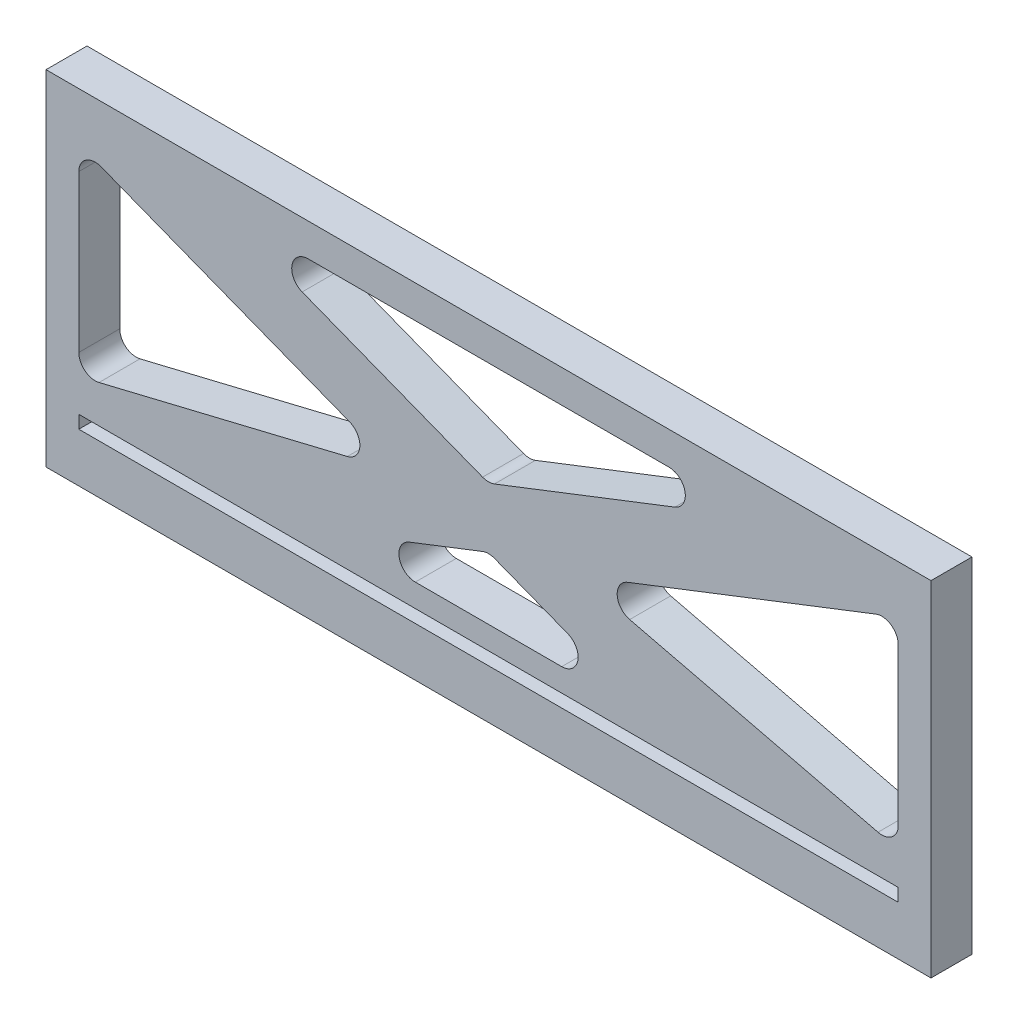
ISO-10303-21;
HEADER;
FILE_DESCRIPTION(('STEP AP214'),'2;1');
FILE_NAME('part.step','',(''),(''),'','','');
FILE_SCHEMA(('AUTOMOTIVE_DESIGN { 1 0 10303 214 1 1 1 1 }'));
ENDSEC;
DATA;
#1=APPLICATION_CONTEXT('core data for automotive mechanical design processes');
#2=APPLICATION_PROTOCOL_DEFINITION('international standard','automotive_design',2000,#1);
#3=PRODUCT_CONTEXT('',#1,'mechanical');
#4=PRODUCT('Part','Part','',(#3));
#5=PRODUCT_RELATED_PRODUCT_CATEGORY('part','',(#4));
#6=PRODUCT_DEFINITION_FORMATION('','',#4);
#7=PRODUCT_DEFINITION_CONTEXT('part definition',#1,'design');
#8=PRODUCT_DEFINITION('design','',#6,#7);
#9=PRODUCT_DEFINITION_SHAPE('','',#8);
#10=(LENGTH_UNIT() NAMED_UNIT(*) SI_UNIT(.MILLI.,.METRE.));
#11=(NAMED_UNIT(*) PLANE_ANGLE_UNIT() SI_UNIT($,.RADIAN.));
#12=(NAMED_UNIT(*) SI_UNIT($,.STERADIAN.) SOLID_ANGLE_UNIT());
#13=UNCERTAINTY_MEASURE_WITH_UNIT(LENGTH_MEASURE(1.E-05),#10,'distance_accuracy_value','');
#14=(GEOMETRIC_REPRESENTATION_CONTEXT(3) GLOBAL_UNCERTAINTY_ASSIGNED_CONTEXT((#13)) GLOBAL_UNIT_ASSIGNED_CONTEXT((#10,
#11,#12)) REPRESENTATION_CONTEXT('',''));
#15=CARTESIAN_POINT('',(0.,0.,0.));
#16=DIRECTION('',(0.,0.,1.));
#17=DIRECTION('',(1.,0.,0.));
#18=AXIS2_PLACEMENT_3D('',#15,#16,#17);
#19=CARTESIAN_POINT('',(0.,0.,3.175));
#20=DIRECTION('',(0.,0.,-1.));
#21=DIRECTION('',(-1.,0.,0.));
#22=AXIS2_PLACEMENT_3D('',#19,#20,#21);
#23=PLANE('',#22);
#24=DIRECTION('',(0.971967602609404,-0.235114821901402,0.));
#25=VECTOR('',#24,1.);
#26=CARTESIAN_POINT('',(31.75,-5.985,3.175));
#27=LINE('',#26,#25);
#28=CARTESIAN_POINT('',(10.941024900875,-0.951397582340412,3.175));
#29=VERTEX_POINT('',#28);
#30=CARTESIAN_POINT('',(30.1814041761852,-5.60556335338607,3.175));
#31=VERTEX_POINT('',#30);
#32=EDGE_CURVE('E532',#29,#31,#27,.T.);
#33=ORIENTED_EDGE('',*,*,#32,.F.);
#34=CARTESIAN_POINT('',(11.2396207246898,0.283001272973529,3.175));
#35=DIRECTION('',(0.,0.,-1.));
#36=DIRECTION('',(-1.,0.,0.));
#37=AXIS2_PLACEMENT_3D('',#34,#35,#36);
#38=CIRCLE('',#37,1.27);
#39=CARTESIAN_POINT('',(10.779313973023,1.46664720583098,3.175));
#40=VERTEX_POINT('',#39);
#41=EDGE_CURVE('E445',#29,#40,#38,.T.);
#42=ORIENTED_EDGE('',*,*,#41,.T.);
#43=DIRECTION('',(-0.932004671541298,-0.362446261154944,0.));
#44=VECTOR('',#43,1.);
#45=CARTESIAN_POINT('',(7.00793544374329,0.,3.175));
#46=LINE('',#45,#44);
#47=CARTESIAN_POINT('',(30.0196932483333,8.94901692400708,3.175));
#48=VERTEX_POINT('',#47);
#49=EDGE_CURVE('E541',#48,#40,#46,.T.);
#50=ORIENTED_EDGE('',*,*,#49,.F.);
#51=CARTESIAN_POINT('',(30.48,7.76537099114963,3.175));
#52=DIRECTION('',(0.,0.,-1.));
#53=DIRECTION('',(-1.,0.,0.));
#54=AXIS2_PLACEMENT_3D('',#51,#52,#53);
#55=CIRCLE('',#54,1.27);
#56=CARTESIAN_POINT('',(31.75,7.76537099114963,3.175));
#57=VERTEX_POINT('',#56);
#58=EDGE_CURVE('E433',#48,#57,#55,.T.);
#59=ORIENTED_EDGE('',*,*,#58,.T.);
#60=DIRECTION('',(0.,1.,0.));
#61=VECTOR('',#60,1.);
#62=CARTESIAN_POINT('',(31.75,9.62191399409971,3.175));
#63=LINE('',#62,#61);
#64=CARTESIAN_POINT('',(31.75,-4.37116449807213,3.175));
#65=VERTEX_POINT('',#64);
#66=EDGE_CURVE('E536',#65,#57,#63,.T.);
#67=ORIENTED_EDGE('',*,*,#66,.F.);
#68=CARTESIAN_POINT('',(30.48,-4.37116449807213,3.175));
#69=DIRECTION('',(0.,0.,-1.));
#70=DIRECTION('',(-1.,0.,0.));
#71=AXIS2_PLACEMENT_3D('',#68,#69,#70);
#72=CIRCLE('',#71,1.27);
#73=EDGE_CURVE('E439',#65,#31,#72,.T.);
#74=ORIENTED_EDGE('',*,*,#73,.T.);
#75=EDGE_LOOP('',(#33,#42,#50,#59,#67,#74));
#76=FACE_BOUND('',#75,.T.);
#77=DIRECTION('',(-1.,0.,0.));
#78=VECTOR('',#77,1.);
#79=CARTESIAN_POINT('',(20.7506359848282,10.795,3.175));
#80=LINE('',#79,#78);
#81=CARTESIAN_POINT('',(13.9809539772422,10.795,3.175));
#82=VERTEX_POINT('',#81);
#83=CARTESIAN_POINT('',(-13.9809539772422,10.795,3.175));
#84=VERTEX_POINT('',#83);
#85=EDGE_CURVE('E580',#82,#84,#80,.T.);
#86=ORIENTED_EDGE('',*,*,#85,.F.);
#87=CARTESIAN_POINT('',(13.9809539772422,9.52500000000001,3.175));
#88=DIRECTION('',(0.,0.,-1.));
#89=DIRECTION('',(-1.,0.,0.));
#90=AXIS2_PLACEMENT_3D('',#87,#88,#89);
#91=CIRCLE('',#90,1.27);
#92=CARTESIAN_POINT('',(14.441260728909,8.34135406714256,3.175));
#93=VERTEX_POINT('',#92);
#94=EDGE_CURVE('E451',#82,#93,#91,.T.);
#95=ORIENTED_EDGE('',*,*,#94,.T.);
#96=DIRECTION('',(0.932004671541296,0.362446261154949,0.));
#97=VECTOR('',#96,1.);
#98=CARTESIAN_POINT('',(0.,2.72530822812238,3.175));
#99=LINE('',#98,#97);
#100=CARTESIAN_POINT('',(0.460306751666785,2.90431640932613,3.175));
#101=VERTEX_POINT('',#100);
#102=EDGE_CURVE('E289',#101,#93,#99,.T.);
#103=ORIENTED_EDGE('',*,*,#102,.F.);
#104=CARTESIAN_POINT('',(0.,4.08796234218358,3.175));
#105=DIRECTION('',(0.,0.,-1.));
#106=DIRECTION('',(-1.,0.,0.));
#107=AXIS2_PLACEMENT_3D('',#104,#105,#106);
#108=CIRCLE('',#107,1.27);
#109=CARTESIAN_POINT('',(-0.460306751666785,2.90431640932613,3.175));
#110=VERTEX_POINT('',#109);
#111=EDGE_CURVE('E463',#101,#110,#108,.T.);
#112=ORIENTED_EDGE('',*,*,#111,.T.);
#113=DIRECTION('',(0.932004671541296,-0.362446261154949,0.));
#114=VECTOR('',#113,1.);
#115=CARTESIAN_POINT('',(-20.7506359848282,10.795,3.175));
#116=LINE('',#115,#114);
#117=CARTESIAN_POINT('',(-14.441260728909,8.34135406714256,3.175));
#118=VERTEX_POINT('',#117);
#119=EDGE_CURVE('E584',#118,#110,#116,.T.);
#120=ORIENTED_EDGE('',*,*,#119,.F.);
#121=CARTESIAN_POINT('',(-13.9809539772422,9.52500000000001,3.175));
#122=DIRECTION('',(0.,0.,-1.));
#123=DIRECTION('',(-1.,0.,0.));
#124=AXIS2_PLACEMENT_3D('',#121,#122,#123);
#125=CIRCLE('',#124,1.27);
#126=EDGE_CURVE('E457',#118,#84,#125,.T.);
#127=ORIENTED_EDGE('',*,*,#126,.T.);
#128=EDGE_LOOP('',(#86,#95,#103,#112,#120,#127));
#129=FACE_BOUND('',#128,.T.);
#130=DIRECTION('',(0.,1.,0.));
#131=VECTOR('',#130,1.);
#132=CARTESIAN_POINT('',(34.29,-13.335,3.175));
#133=LINE('',#132,#131);
#134=CARTESIAN_POINT('',(34.29,-13.335,3.175));
#135=VERTEX_POINT('',#134);
#136=CARTESIAN_POINT('',(34.29,13.335,3.175));
#137=VERTEX_POINT('',#136);
#138=EDGE_CURVE('E306',#135,#137,#133,.T.);
#139=ORIENTED_EDGE('',*,*,#138,.T.);
#140=DIRECTION('',(-1.,0.,0.));
#141=VECTOR('',#140,1.);
#142=CARTESIAN_POINT('',(-34.29,13.335,3.175));
#143=LINE('',#142,#141);
#144=CARTESIAN_POINT('',(-34.29,13.335,3.175));
#145=VERTEX_POINT('',#144);
#146=EDGE_CURVE('E310',#137,#145,#143,.T.);
#147=ORIENTED_EDGE('',*,*,#146,.T.);
#148=DIRECTION('',(0.,-1.,0.));
#149=VECTOR('',#148,1.);
#150=CARTESIAN_POINT('',(-34.29,-13.335,3.175));
#151=LINE('',#150,#149);
#152=CARTESIAN_POINT('',(-34.29,-13.335,3.175));
#153=VERTEX_POINT('',#152);
#154=EDGE_CURVE('E314',#145,#153,#151,.T.);
#155=ORIENTED_EDGE('',*,*,#154,.T.);
#156=DIRECTION('',(1.,0.,0.));
#157=VECTOR('',#156,1.);
#158=CARTESIAN_POINT('',(-34.29,-13.335,3.175));
#159=LINE('',#158,#157);
#160=EDGE_CURVE('E317',#153,#135,#159,.T.);
#161=ORIENTED_EDGE('',*,*,#160,.T.);
#162=EDGE_LOOP('',(#139,#147,#155,#161));
#163=FACE_BOUND('',#162,.T.);
#164=DIRECTION('',(0.,1.,0.));
#165=VECTOR('',#164,1.);
#166=CARTESIAN_POINT('',(31.75,-9.525,3.175));
#167=LINE('',#166,#165);
#168=CARTESIAN_POINT('',(31.75,-9.525,3.175));
#169=VERTEX_POINT('',#168);
#170=CARTESIAN_POINT('',(31.75,-8.525,3.175));
#171=VERTEX_POINT('',#170);
#172=EDGE_CURVE('E250',#169,#171,#167,.T.);
#173=ORIENTED_EDGE('',*,*,#172,.F.);
#174=DIRECTION('',(1.,0.,0.));
#175=VECTOR('',#174,1.);
#176=CARTESIAN_POINT('',(-31.75,-9.525,3.175));
#177=LINE('',#176,#175);
#178=CARTESIAN_POINT('',(-31.75,-9.525,3.175));
#179=VERTEX_POINT('',#178);
#180=EDGE_CURVE('E280',#179,#169,#177,.T.);
#181=ORIENTED_EDGE('',*,*,#180,.F.);
#182=DIRECTION('',(0.,-1.,0.));
#183=VECTOR('',#182,1.);
#184=CARTESIAN_POINT('',(-31.75,-9.525,3.175));
#185=LINE('',#184,#183);
#186=CARTESIAN_POINT('',(-31.75,-8.525,3.175));
#187=VERTEX_POINT('',#186);
#188=EDGE_CURVE('E276',#187,#179,#185,.T.);
#189=ORIENTED_EDGE('',*,*,#188,.F.);
#190=DIRECTION('',(-1.,0.,0.));
#191=VECTOR('',#190,1.);
#192=CARTESIAN_POINT('',(-31.75,-8.525,3.175));
#193=LINE('',#192,#191);
#194=EDGE_CURVE('E261',#171,#187,#193,.T.);
#195=ORIENTED_EDGE('',*,*,#194,.F.);
#196=EDGE_LOOP('',(#173,#181,#189,#195));
#197=FACE_BOUND('',#196,.T.);
#198=DIRECTION('',(-0.932004671541296,0.362446261154948,0.));
#199=VECTOR('',#198,1.);
#200=CARTESIAN_POINT('',(-7.0079354437433,0.,3.175));
#201=LINE('',#200,#199);
#202=CARTESIAN_POINT('',(-10.779313973023,1.46664720583098,3.175));
#203=VERTEX_POINT('',#202);
#204=CARTESIAN_POINT('',(-30.0196932483332,8.94901692400719,3.175));
#205=VERTEX_POINT('',#204);
#206=EDGE_CURVE('E556',#203,#205,#201,.T.);
#207=ORIENTED_EDGE('',*,*,#206,.F.);
#208=CARTESIAN_POINT('',(-11.2396207246897,0.283001272973534,3.175));
#209=DIRECTION('',(0.,0.,-1.));
#210=DIRECTION('',(-1.,0.,0.));
#211=AXIS2_PLACEMENT_3D('',#208,#209,#210);
#212=CIRCLE('',#211,1.27);
#213=CARTESIAN_POINT('',(-10.941024900875,-0.951397582340408,3.175));
#214=VERTEX_POINT('',#213);
#215=EDGE_CURVE('E469',#203,#214,#212,.T.);
#216=ORIENTED_EDGE('',*,*,#215,.T.);
#217=DIRECTION('',(0.971967602609404,0.235114821901402,0.));
#218=VECTOR('',#217,1.);
#219=CARTESIAN_POINT('',(-31.75,-5.985,3.175));
#220=LINE('',#219,#218);
#221=CARTESIAN_POINT('',(-30.1814041761852,-5.60556335338607,3.175));
#222=VERTEX_POINT('',#221);
#223=EDGE_CURVE('E565',#222,#214,#220,.T.);
#224=ORIENTED_EDGE('',*,*,#223,.F.);
#225=CARTESIAN_POINT('',(-30.48,-4.37116449807213,3.175));
#226=DIRECTION('',(0.,0.,-1.));
#227=DIRECTION('',(-1.,0.,0.));
#228=AXIS2_PLACEMENT_3D('',#225,#226,#227);
#229=CIRCLE('',#228,1.27);
#230=CARTESIAN_POINT('',(-31.75,-4.37116449807213,3.175));
#231=VERTEX_POINT('',#230);
#232=EDGE_CURVE('E481',#222,#231,#229,.T.);
#233=ORIENTED_EDGE('',*,*,#232,.T.);
#234=DIRECTION('',(0.,-1.,0.));
#235=VECTOR('',#234,1.);
#236=CARTESIAN_POINT('',(-31.75,9.62191399409983,3.175));
#237=LINE('',#236,#235);
#238=CARTESIAN_POINT('',(-31.75,7.76537099114975,3.175));
#239=VERTEX_POINT('',#238);
#240=EDGE_CURVE('E560',#239,#231,#237,.T.);
#241=ORIENTED_EDGE('',*,*,#240,.F.);
#242=CARTESIAN_POINT('',(-30.48,7.76537099114975,3.175));
#243=DIRECTION('',(0.,0.,-1.));
#244=DIRECTION('',(-1.,0.,0.));
#245=AXIS2_PLACEMENT_3D('',#242,#243,#244);
#246=CIRCLE('',#245,1.27);
#247=EDGE_CURVE('E475',#239,#205,#246,.T.);
#248=ORIENTED_EDGE('',*,*,#247,.T.);
#249=EDGE_LOOP('',(#207,#216,#224,#233,#241,#248));
#250=FACE_BOUND('',#249,.T.);
#251=DIRECTION('',(-0.932004671541296,0.362446261154949,0.));
#252=VECTOR('',#251,1.);
#253=CARTESIAN_POINT('',(12.4438737608083,-6.747,3.175));
#254=LINE('',#253,#252);
#255=CARTESIAN_POINT('',(6.13449850488913,-4.29335406714256,3.175));
#256=VERTEX_POINT('',#255);
#257=CARTESIAN_POINT('',(0.46030675166678,-2.08672394088942,3.175));
#258=VERTEX_POINT('',#257);
#259=EDGE_CURVE('E511',#256,#258,#254,.T.);
#260=ORIENTED_EDGE('',*,*,#259,.F.);
#261=CARTESIAN_POINT('',(5.67419175322234,-5.477,3.175));
#262=DIRECTION('',(0.,0.,-1.));
#263=DIRECTION('',(-1.,0.,0.));
#264=AXIS2_PLACEMENT_3D('',#261,#262,#263);
#265=CIRCLE('',#264,1.27);
#266=CARTESIAN_POINT('',(5.67419175322234,-6.747,3.175));
#267=VERTEX_POINT('',#266);
#268=EDGE_CURVE('E487',#256,#267,#265,.T.);
#269=ORIENTED_EDGE('',*,*,#268,.T.);
#270=DIRECTION('',(1.,0.,0.));
#271=VECTOR('',#270,1.);
#272=CARTESIAN_POINT('',(-12.4438737608083,-6.747,3.175));
#273=LINE('',#272,#271);
#274=CARTESIAN_POINT('',(-5.67419175322235,-6.747,3.175));
#275=VERTEX_POINT('',#274);
#276=EDGE_CURVE('E517',#275,#267,#273,.T.);
#277=ORIENTED_EDGE('',*,*,#276,.F.);
#278=CARTESIAN_POINT('',(-5.67419175322235,-5.477,3.175));
#279=DIRECTION('',(0.,0.,-1.));
#280=DIRECTION('',(-1.,0.,0.));
#281=AXIS2_PLACEMENT_3D('',#278,#279,#280);
#282=CIRCLE('',#281,1.27);
#283=CARTESIAN_POINT('',(-6.13449850488913,-4.29335406714256,3.175));
#284=VERTEX_POINT('',#283);
#285=EDGE_CURVE('E11',#275,#284,#282,.T.);
#286=ORIENTED_EDGE('',*,*,#285,.T.);
#287=DIRECTION('',(-0.932004671541296,-0.362446261154949,0.));
#288=VECTOR('',#287,1.);
#289=CARTESIAN_POINT('',(0.,-1.90771575968567,3.175));
#290=LINE('',#289,#288);
#291=CARTESIAN_POINT('',(-0.460306751666788,-2.08672394088942,3.175));
#292=VERTEX_POINT('',#291);
#293=EDGE_CURVE('E514',#292,#284,#290,.T.);
#294=ORIENTED_EDGE('',*,*,#293,.F.);
#295=CARTESIAN_POINT('',(0.,-3.27036987374687,3.175));
#296=DIRECTION('',(0.,0.,-1.));
#297=DIRECTION('',(-1.,0.,0.));
#298=AXIS2_PLACEMENT_3D('',#295,#296,#297);
#299=CIRCLE('',#298,1.27);
#300=EDGE_CURVE('E493',#292,#258,#299,.T.);
#301=ORIENTED_EDGE('',*,*,#300,.T.);
#302=EDGE_LOOP('',(#260,#269,#277,#286,#294,#301));
#303=FACE_BOUND('',#302,.T.);
#304=ADVANCED_FACE('F39',(#76,#129,#163,#197,#250,#303),#23,.F.);
#305=CARTESIAN_POINT('',(0.,0.,0.));
#306=DIRECTION('',(0.,0.,-1.));
#307=DIRECTION('',(-1.,0.,0.));
#308=AXIS2_PLACEMENT_3D('',#305,#306,#307);
#309=PLANE('',#308);
#310=DIRECTION('',(0.,1.,0.));
#311=VECTOR('',#310,1.);
#312=CARTESIAN_POINT('',(34.29,-13.335,0.));
#313=LINE('',#312,#311);
#314=CARTESIAN_POINT('',(34.29,-13.335,0.));
#315=VERTEX_POINT('',#314);
#316=CARTESIAN_POINT('',(34.29,13.335,0.));
#317=VERTEX_POINT('',#316);
#318=EDGE_CURVE('E270',#315,#317,#313,.T.);
#319=ORIENTED_EDGE('',*,*,#318,.F.);
#320=DIRECTION('',(1.,0.,0.));
#321=VECTOR('',#320,1.);
#322=CARTESIAN_POINT('',(-34.29,-13.335,0.));
#323=LINE('',#322,#321);
#324=CARTESIAN_POINT('',(-34.29,-13.335,0.));
#325=VERTEX_POINT('',#324);
#326=EDGE_CURVE('E311',#325,#315,#323,.T.);
#327=ORIENTED_EDGE('',*,*,#326,.F.);
#328=DIRECTION('',(0.,-1.,0.));
#329=VECTOR('',#328,1.);
#330=CARTESIAN_POINT('',(-34.29,-13.335,0.));
#331=LINE('',#330,#329);
#332=CARTESIAN_POINT('',(-34.29,13.335,0.));
#333=VERTEX_POINT('',#332);
#334=EDGE_CURVE('E327',#333,#325,#331,.T.);
#335=ORIENTED_EDGE('',*,*,#334,.F.);
#336=DIRECTION('',(-1.,0.,0.));
#337=VECTOR('',#336,1.);
#338=CARTESIAN_POINT('',(-34.29,13.335,0.));
#339=LINE('',#338,#337);
#340=EDGE_CURVE('E324',#317,#333,#339,.T.);
#341=ORIENTED_EDGE('',*,*,#340,.F.);
#342=EDGE_LOOP('',(#319,#327,#335,#341));
#343=FACE_BOUND('',#342,.T.);
#344=DIRECTION('',(1.,0.,0.));
#345=VECTOR('',#344,1.);
#346=CARTESIAN_POINT('',(-31.75,-9.525,0.));
#347=LINE('',#346,#345);
#348=CARTESIAN_POINT('',(-31.75,-9.525,0.));
#349=VERTEX_POINT('',#348);
#350=CARTESIAN_POINT('',(31.75,-9.525,0.));
#351=VERTEX_POINT('',#350);
#352=EDGE_CURVE('E262',#349,#351,#347,.T.);
#353=ORIENTED_EDGE('',*,*,#352,.T.);
#354=DIRECTION('',(0.,1.,0.));
#355=VECTOR('',#354,1.);
#356=CARTESIAN_POINT('',(31.75,-9.525,0.));
#357=LINE('',#356,#355);
#358=CARTESIAN_POINT('',(31.75,-8.525,0.));
#359=VERTEX_POINT('',#358);
#360=EDGE_CURVE('E286',#351,#359,#357,.T.);
#361=ORIENTED_EDGE('',*,*,#360,.T.);
#362=DIRECTION('',(-1.,0.,0.));
#363=VECTOR('',#362,1.);
#364=CARTESIAN_POINT('',(-31.75,-8.525,0.));
#365=LINE('',#364,#363);
#366=CARTESIAN_POINT('',(-31.75,-8.525,0.));
#367=VERTEX_POINT('',#366);
#368=EDGE_CURVE('E268',#359,#367,#365,.T.);
#369=ORIENTED_EDGE('',*,*,#368,.T.);
#370=DIRECTION('',(0.,-1.,0.));
#371=VECTOR('',#370,1.);
#372=CARTESIAN_POINT('',(-31.75,-9.525,0.));
#373=LINE('',#372,#371);
#374=EDGE_CURVE('E292',#367,#349,#373,.T.);
#375=ORIENTED_EDGE('',*,*,#374,.T.);
#376=EDGE_LOOP('',(#353,#361,#369,#375));
#377=FACE_BOUND('',#376,.T.);
#378=DIRECTION('',(0.932004671541296,-0.362446261154949,0.));
#379=VECTOR('',#378,1.);
#380=CARTESIAN_POINT('',(-20.7506359848282,10.795,0.));
#381=LINE('',#380,#379);
#382=CARTESIAN_POINT('',(-14.441260728909,8.34135406714256,0.));
#383=VERTEX_POINT('',#382);
#384=CARTESIAN_POINT('',(-0.460306751666785,2.90431640932613,0.));
#385=VERTEX_POINT('',#384);
#386=EDGE_CURVE('E595',#383,#385,#381,.T.);
#387=ORIENTED_EDGE('',*,*,#386,.T.);
#388=CARTESIAN_POINT('',(0.,4.08796234218358,0.));
#389=DIRECTION('',(0.,0.,-1.));
#390=DIRECTION('',(-1.,0.,0.));
#391=AXIS2_PLACEMENT_3D('',#388,#389,#390);
#392=CIRCLE('',#391,1.27);
#393=CARTESIAN_POINT('',(0.460306751666785,2.90431640932613,0.));
#394=VERTEX_POINT('',#393);
#395=EDGE_CURVE('E460',#385,#394,#392,.F.);
#396=ORIENTED_EDGE('',*,*,#395,.T.);
#397=DIRECTION('',(0.932004671541296,0.362446261154949,0.));
#398=VECTOR('',#397,1.);
#399=CARTESIAN_POINT('',(0.,2.72530822812238,0.));
#400=LINE('',#399,#398);
#401=CARTESIAN_POINT('',(14.441260728909,8.34135406714256,0.));
#402=VERTEX_POINT('',#401);
#403=EDGE_CURVE('E585',#394,#402,#400,.T.);
#404=ORIENTED_EDGE('',*,*,#403,.T.);
#405=CARTESIAN_POINT('',(13.9809539772422,9.52500000000001,0.));
#406=DIRECTION('',(0.,0.,-1.));
#407=DIRECTION('',(-1.,0.,0.));
#408=AXIS2_PLACEMENT_3D('',#405,#406,#407);
#409=CIRCLE('',#408,1.27);
#410=CARTESIAN_POINT('',(13.9809539772422,10.795,0.));
#411=VERTEX_POINT('',#410);
#412=EDGE_CURVE('E448',#402,#411,#409,.F.);
#413=ORIENTED_EDGE('',*,*,#412,.T.);
#414=DIRECTION('',(-1.,0.,0.));
#415=VECTOR('',#414,1.);
#416=CARTESIAN_POINT('',(20.7506359848282,10.795,0.));
#417=LINE('',#416,#415);
#418=CARTESIAN_POINT('',(-13.9809539772422,10.795,0.));
#419=VERTEX_POINT('',#418);
#420=EDGE_CURVE('E569',#411,#419,#417,.T.);
#421=ORIENTED_EDGE('',*,*,#420,.T.);
#422=CARTESIAN_POINT('',(-13.9809539772422,9.52500000000001,0.));
#423=DIRECTION('',(0.,0.,-1.));
#424=DIRECTION('',(-1.,0.,0.));
#425=AXIS2_PLACEMENT_3D('',#422,#423,#424);
#426=CIRCLE('',#425,1.27);
#427=EDGE_CURVE('E454',#419,#383,#426,.F.);
#428=ORIENTED_EDGE('',*,*,#427,.T.);
#429=EDGE_LOOP('',(#387,#396,#404,#413,#421,#428));
#430=FACE_BOUND('',#429,.T.);
#431=DIRECTION('',(0.,-1.,0.));
#432=VECTOR('',#431,1.);
#433=CARTESIAN_POINT('',(-31.75,9.62191399409983,0.));
#434=LINE('',#433,#432);
#435=CARTESIAN_POINT('',(-31.75,7.76537099114975,0.));
#436=VERTEX_POINT('',#435);
#437=CARTESIAN_POINT('',(-31.75,-4.37116449807213,0.));
#438=VERTEX_POINT('',#437);
#439=EDGE_CURVE('E573',#436,#438,#434,.T.);
#440=ORIENTED_EDGE('',*,*,#439,.T.);
#441=CARTESIAN_POINT('',(-30.48,-4.37116449807213,0.));
#442=DIRECTION('',(0.,0.,-1.));
#443=DIRECTION('',(-1.,0.,0.));
#444=AXIS2_PLACEMENT_3D('',#441,#442,#443);
#445=CIRCLE('',#444,1.27);
#446=CARTESIAN_POINT('',(-30.1814041761852,-5.60556335338607,0.));
#447=VERTEX_POINT('',#446);
#448=EDGE_CURVE('E478',#438,#447,#445,.F.);
#449=ORIENTED_EDGE('',*,*,#448,.T.);
#450=DIRECTION('',(0.971967602609404,0.235114821901402,0.));
#451=VECTOR('',#450,1.);
#452=CARTESIAN_POINT('',(-31.75,-5.985,0.));
#453=LINE('',#452,#451);
#454=CARTESIAN_POINT('',(-10.941024900875,-0.951397582340408,0.));
#455=VERTEX_POINT('',#454);
#456=EDGE_CURVE('E561',#447,#455,#453,.T.);
#457=ORIENTED_EDGE('',*,*,#456,.T.);
#458=CARTESIAN_POINT('',(-11.2396207246897,0.283001272973534,0.));
#459=DIRECTION('',(0.,0.,-1.));
#460=DIRECTION('',(-1.,0.,0.));
#461=AXIS2_PLACEMENT_3D('',#458,#459,#460);
#462=CIRCLE('',#461,1.27);
#463=CARTESIAN_POINT('',(-10.779313973023,1.46664720583098,0.));
#464=VERTEX_POINT('',#463);
#465=EDGE_CURVE('E466',#455,#464,#462,.F.);
#466=ORIENTED_EDGE('',*,*,#465,.T.);
#467=DIRECTION('',(-0.932004671541296,0.362446261154948,0.));
#468=VECTOR('',#467,1.);
#469=CARTESIAN_POINT('',(-7.0079354437433,0.,0.));
#470=LINE('',#469,#468);
#471=CARTESIAN_POINT('',(-30.0196932483332,8.94901692400719,0.));
#472=VERTEX_POINT('',#471);
#473=EDGE_CURVE('E545',#464,#472,#470,.T.);
#474=ORIENTED_EDGE('',*,*,#473,.T.);
#475=CARTESIAN_POINT('',(-30.48,7.76537099114975,0.));
#476=DIRECTION('',(0.,0.,-1.));
#477=DIRECTION('',(-1.,0.,0.));
#478=AXIS2_PLACEMENT_3D('',#475,#476,#477);
#479=CIRCLE('',#478,1.27);
#480=EDGE_CURVE('E472',#472,#436,#479,.F.);
#481=ORIENTED_EDGE('',*,*,#480,.T.);
#482=EDGE_LOOP('',(#440,#449,#457,#466,#474,#481));
#483=FACE_BOUND('',#482,.T.);
#484=DIRECTION('',(0.,1.,0.));
#485=VECTOR('',#484,1.);
#486=CARTESIAN_POINT('',(31.75,9.62191399409971,0.));
#487=LINE('',#486,#485);
#488=CARTESIAN_POINT('',(31.75,-4.37116449807213,0.));
#489=VERTEX_POINT('',#488);
#490=CARTESIAN_POINT('',(31.75,7.76537099114963,0.));
#491=VERTEX_POINT('',#490);
#492=EDGE_CURVE('E549',#489,#491,#487,.T.);
#493=ORIENTED_EDGE('',*,*,#492,.T.);
#494=CARTESIAN_POINT('',(30.48,7.76537099114963,0.));
#495=DIRECTION('',(0.,0.,-1.));
#496=DIRECTION('',(-1.,0.,0.));
#497=AXIS2_PLACEMENT_3D('',#494,#495,#496);
#498=CIRCLE('',#497,1.27);
#499=CARTESIAN_POINT('',(30.0196932483333,8.94901692400708,0.));
#500=VERTEX_POINT('',#499);
#501=EDGE_CURVE('E430',#491,#500,#498,.F.);
#502=ORIENTED_EDGE('',*,*,#501,.T.);
#503=DIRECTION('',(-0.932004671541298,-0.362446261154944,0.));
#504=VECTOR('',#503,1.);
#505=CARTESIAN_POINT('',(7.00793544374329,0.,0.));
#506=LINE('',#505,#504);
#507=CARTESIAN_POINT('',(10.779313973023,1.46664720583098,0.));
#508=VERTEX_POINT('',#507);
#509=EDGE_CURVE('E537',#500,#508,#506,.T.);
#510=ORIENTED_EDGE('',*,*,#509,.T.);
#511=CARTESIAN_POINT('',(11.2396207246898,0.283001272973529,0.));
#512=DIRECTION('',(0.,0.,-1.));
#513=DIRECTION('',(-1.,0.,0.));
#514=AXIS2_PLACEMENT_3D('',#511,#512,#513);
#515=CIRCLE('',#514,1.27);
#516=CARTESIAN_POINT('',(10.941024900875,-0.951397582340412,0.));
#517=VERTEX_POINT('',#516);
#518=EDGE_CURVE('E442',#508,#517,#515,.F.);
#519=ORIENTED_EDGE('',*,*,#518,.T.);
#520=DIRECTION('',(0.971967602609404,-0.235114821901402,0.));
#521=VECTOR('',#520,1.);
#522=CARTESIAN_POINT('',(31.75,-5.985,0.));
#523=LINE('',#522,#521);
#524=CARTESIAN_POINT('',(30.1814041761852,-5.60556335338607,0.));
#525=VERTEX_POINT('',#524);
#526=EDGE_CURVE('E521',#517,#525,#523,.T.);
#527=ORIENTED_EDGE('',*,*,#526,.T.);
#528=CARTESIAN_POINT('',(30.48,-4.37116449807213,0.));
#529=DIRECTION('',(0.,0.,-1.));
#530=DIRECTION('',(-1.,0.,0.));
#531=AXIS2_PLACEMENT_3D('',#528,#529,#530);
#532=CIRCLE('',#531,1.27);
#533=EDGE_CURVE('E436',#525,#489,#532,.F.);
#534=ORIENTED_EDGE('',*,*,#533,.T.);
#535=EDGE_LOOP('',(#493,#502,#510,#519,#527,#534));
#536=FACE_BOUND('',#535,.T.);
#537=DIRECTION('',(-0.932004671541296,-0.362446261154949,0.));
#538=VECTOR('',#537,1.);
#539=CARTESIAN_POINT('',(0.,-1.90771575968567,0.));
#540=LINE('',#539,#538);
#541=CARTESIAN_POINT('',(-0.460306751666788,-2.08672394088942,0.));
#542=VERTEX_POINT('',#541);
#543=CARTESIAN_POINT('',(-6.13449850488913,-4.29335406714256,0.));
#544=VERTEX_POINT('',#543);
#545=EDGE_CURVE('E502',#542,#544,#540,.T.);
#546=ORIENTED_EDGE('',*,*,#545,.T.);
#547=CARTESIAN_POINT('',(-5.67419175322235,-5.477,0.));
#548=DIRECTION('',(0.,0.,-1.));
#549=DIRECTION('',(-1.,0.,0.));
#550=AXIS2_PLACEMENT_3D('',#547,#548,#549);
#551=CIRCLE('',#550,1.27);
#552=CARTESIAN_POINT('',(-5.67419175322235,-6.747,0.));
#553=VERTEX_POINT('',#552);
#554=EDGE_CURVE('E48',#544,#553,#551,.F.);
#555=ORIENTED_EDGE('',*,*,#554,.T.);
#556=DIRECTION('',(1.,0.,0.));
#557=VECTOR('',#556,1.);
#558=CARTESIAN_POINT('',(-12.4438737608083,-6.747,0.));
#559=LINE('',#558,#557);
#560=CARTESIAN_POINT('',(5.67419175322234,-6.747,0.));
#561=VERTEX_POINT('',#560);
#562=EDGE_CURVE('E501',#553,#561,#559,.T.);
#563=ORIENTED_EDGE('',*,*,#562,.T.);
#564=CARTESIAN_POINT('',(5.67419175322234,-5.477,0.));
#565=DIRECTION('',(0.,0.,-1.));
#566=DIRECTION('',(-1.,0.,0.));
#567=AXIS2_PLACEMENT_3D('',#564,#565,#566);
#568=CIRCLE('',#567,1.27);
#569=CARTESIAN_POINT('',(6.13449850488913,-4.29335406714256,0.));
#570=VERTEX_POINT('',#569);
#571=EDGE_CURVE('E484',#561,#570,#568,.F.);
#572=ORIENTED_EDGE('',*,*,#571,.T.);
#573=DIRECTION('',(-0.932004671541296,0.362446261154949,0.));
#574=VECTOR('',#573,1.);
#575=CARTESIAN_POINT('',(12.4438737608083,-6.747,0.));
#576=LINE('',#575,#574);
#577=CARTESIAN_POINT('',(0.46030675166678,-2.08672394088942,0.));
#578=VERTEX_POINT('',#577);
#579=EDGE_CURVE('E526',#570,#578,#576,.T.);
#580=ORIENTED_EDGE('',*,*,#579,.T.);
#581=CARTESIAN_POINT('',(0.,-3.27036987374687,0.));
#582=DIRECTION('',(0.,0.,-1.));
#583=DIRECTION('',(-1.,0.,0.));
#584=AXIS2_PLACEMENT_3D('',#581,#582,#583);
#585=CIRCLE('',#584,1.27);
#586=EDGE_CURVE('E490',#578,#542,#585,.F.);
#587=ORIENTED_EDGE('',*,*,#586,.T.);
#588=EDGE_LOOP('',(#546,#555,#563,#572,#580,#587));
#589=FACE_BOUND('',#588,.T.);
#590=ADVANCED_FACE('F500',(#343,#377,#430,#483,#536,#589),#309,.T.);
#591=CARTESIAN_POINT('',(34.29,-13.335,3.175));
#592=DIRECTION('',(-1.,0.,0.));
#593=DIRECTION('',(0.,0.,1.));
#594=AXIS2_PLACEMENT_3D('',#591,#592,#593);
#595=PLANE('',#594);
#596=ORIENTED_EDGE('',*,*,#318,.T.);
#597=DIRECTION('',(0.,0.,-1.));
#598=VECTOR('',#597,1.);
#599=CARTESIAN_POINT('',(34.29,13.335,3.175));
#600=LINE('',#599,#598);
#601=EDGE_CURVE('E343',#137,#317,#600,.T.);
#602=ORIENTED_EDGE('',*,*,#601,.F.);
#603=ORIENTED_EDGE('',*,*,#138,.F.);
#604=DIRECTION('',(0.,0.,-1.));
#605=VECTOR('',#604,1.);
#606=CARTESIAN_POINT('',(34.29,-13.335,3.175));
#607=LINE('',#606,#605);
#608=EDGE_CURVE('E320',#135,#315,#607,.T.);
#609=ORIENTED_EDGE('',*,*,#608,.T.);
#610=EDGE_LOOP('',(#596,#602,#603,#609));
#611=FACE_BOUND('',#610,.T.);
#612=ADVANCED_FACE('F648',(#611),#595,.F.);
#613=CARTESIAN_POINT('',(-34.29,13.335,3.175));
#614=DIRECTION('',(0.,-1.,0.));
#615=DIRECTION('',(0.,0.,-1.));
#616=AXIS2_PLACEMENT_3D('',#613,#614,#615);
#617=PLANE('',#616);
#618=ORIENTED_EDGE('',*,*,#340,.T.);
#619=DIRECTION('',(0.,0.,-1.));
#620=VECTOR('',#619,1.);
#621=CARTESIAN_POINT('',(-34.29,13.335,3.175));
#622=LINE('',#621,#620);
#623=EDGE_CURVE('E339',#145,#333,#622,.T.);
#624=ORIENTED_EDGE('',*,*,#623,.F.);
#625=ORIENTED_EDGE('',*,*,#146,.F.);
#626=ORIENTED_EDGE('',*,*,#601,.T.);
#627=EDGE_LOOP('',(#618,#624,#625,#626));
#628=FACE_BOUND('',#627,.T.);
#629=ADVANCED_FACE('F662',(#628),#617,.F.);
#630=CARTESIAN_POINT('',(-34.29,-13.335,3.175));
#631=DIRECTION('',(1.,0.,0.));
#632=DIRECTION('',(0.,0.,-1.));
#633=AXIS2_PLACEMENT_3D('',#630,#631,#632);
#634=PLANE('',#633);
#635=ORIENTED_EDGE('',*,*,#334,.T.);
#636=DIRECTION('',(0.,0.,-1.));
#637=VECTOR('',#636,1.);
#638=CARTESIAN_POINT('',(-34.29,-13.335,3.175));
#639=LINE('',#638,#637);
#640=EDGE_CURVE('E335',#153,#325,#639,.T.);
#641=ORIENTED_EDGE('',*,*,#640,.F.);
#642=ORIENTED_EDGE('',*,*,#154,.F.);
#643=ORIENTED_EDGE('',*,*,#623,.T.);
#644=EDGE_LOOP('',(#635,#641,#642,#643));
#645=FACE_BOUND('',#644,.T.);
#646=ADVANCED_FACE('F658',(#645),#634,.F.);
#647=CARTESIAN_POINT('',(-34.29,-13.335,3.175));
#648=DIRECTION('',(0.,1.,0.));
#649=DIRECTION('',(-1.,0.,0.));
#650=AXIS2_PLACEMENT_3D('',#647,#648,#649);
#651=PLANE('',#650);
#652=ORIENTED_EDGE('',*,*,#326,.T.);
#653=ORIENTED_EDGE('',*,*,#608,.F.);
#654=ORIENTED_EDGE('',*,*,#160,.F.);
#655=ORIENTED_EDGE('',*,*,#640,.T.);
#656=EDGE_LOOP('',(#652,#653,#654,#655));
#657=FACE_BOUND('',#656,.T.);
#658=ADVANCED_FACE('F655',(#657),#651,.F.);
#659=CARTESIAN_POINT('',(31.75,-9.525,3.175));
#660=DIRECTION('',(-1.,0.,0.));
#661=DIRECTION('',(0.,-1.,0.));
#662=AXIS2_PLACEMENT_3D('',#659,#660,#661);
#663=PLANE('',#662);
#664=ORIENTED_EDGE('',*,*,#360,.F.);
#665=DIRECTION('',(0.,0.,-1.));
#666=VECTOR('',#665,1.);
#667=CARTESIAN_POINT('',(31.75,-9.525,3.175));
#668=LINE('',#667,#666);
#669=EDGE_CURVE('E256',#169,#351,#668,.T.);
#670=ORIENTED_EDGE('',*,*,#669,.F.);
#671=ORIENTED_EDGE('',*,*,#172,.T.);
#672=DIRECTION('',(0.,0.,-1.));
#673=VECTOR('',#672,1.);
#674=CARTESIAN_POINT('',(31.75,-8.525,3.175));
#675=LINE('',#674,#673);
#676=EDGE_CURVE('E253',#171,#359,#675,.T.);
#677=ORIENTED_EDGE('',*,*,#676,.T.);
#678=EDGE_LOOP('',(#664,#670,#671,#677));
#679=FACE_BOUND('',#678,.T.);
#680=ADVANCED_FACE('F252',(#679),#663,.T.);
#681=CARTESIAN_POINT('',(-31.75,-8.525,3.175));
#682=DIRECTION('',(0.,-1.,0.));
#683=DIRECTION('',(0.,0.,-1.));
#684=AXIS2_PLACEMENT_3D('',#681,#682,#683);
#685=PLANE('',#684);
#686=ORIENTED_EDGE('',*,*,#368,.F.);
#687=ORIENTED_EDGE('',*,*,#676,.F.);
#688=ORIENTED_EDGE('',*,*,#194,.T.);
#689=DIRECTION('',(0.,0.,-1.));
#690=VECTOR('',#689,1.);
#691=CARTESIAN_POINT('',(-31.75,-8.525,3.175));
#692=LINE('',#691,#690);
#693=EDGE_CURVE('E271',#187,#367,#692,.T.);
#694=ORIENTED_EDGE('',*,*,#693,.T.);
#695=EDGE_LOOP('',(#686,#687,#688,#694));
#696=FACE_BOUND('',#695,.T.);
#697=ADVANCED_FACE('F265',(#696),#685,.T.);
#698=CARTESIAN_POINT('',(-31.75,-9.525,3.175));
#699=DIRECTION('',(1.,0.,0.));
#700=DIRECTION('',(0.,1.,0.));
#701=AXIS2_PLACEMENT_3D('',#698,#699,#700);
#702=PLANE('',#701);
#703=ORIENTED_EDGE('',*,*,#374,.F.);
#704=ORIENTED_EDGE('',*,*,#693,.F.);
#705=ORIENTED_EDGE('',*,*,#188,.T.);
#706=DIRECTION('',(0.,0.,-1.));
#707=VECTOR('',#706,1.);
#708=CARTESIAN_POINT('',(-31.75,-9.525,3.175));
#709=LINE('',#708,#707);
#710=EDGE_CURVE('E301',#179,#349,#709,.T.);
#711=ORIENTED_EDGE('',*,*,#710,.T.);
#712=EDGE_LOOP('',(#703,#704,#705,#711));
#713=FACE_BOUND('',#712,.T.);
#714=ADVANCED_FACE('F731',(#713),#702,.T.);
#715=CARTESIAN_POINT('',(-31.75,-9.525,3.175));
#716=DIRECTION('',(0.,1.,0.));
#717=DIRECTION('',(0.,0.,1.));
#718=AXIS2_PLACEMENT_3D('',#715,#716,#717);
#719=PLANE('',#718);
#720=ORIENTED_EDGE('',*,*,#352,.F.);
#721=ORIENTED_EDGE('',*,*,#710,.F.);
#722=ORIENTED_EDGE('',*,*,#180,.T.);
#723=ORIENTED_EDGE('',*,*,#669,.T.);
#724=EDGE_LOOP('',(#720,#721,#722,#723));
#725=FACE_BOUND('',#724,.T.);
#726=ADVANCED_FACE('F728',(#725),#719,.T.);
#727=CARTESIAN_POINT('',(20.7506359848282,10.795,3.175));
#728=DIRECTION('',(0.,-1.,0.));
#729=DIRECTION('',(0.,0.,-1.));
#730=AXIS2_PLACEMENT_3D('',#727,#728,#729);
#731=PLANE('',#730);
#732=ORIENTED_EDGE('',*,*,#420,.F.);
#733=DIRECTION('',(0.,0.,-1.));
#734=VECTOR('',#733,1.);
#735=CARTESIAN_POINT('',(13.9809539772422,10.795,3.175));
#736=LINE('',#735,#734);
#737=EDGE_CURVE('E379',#411,#82,#736,.F.);
#738=ORIENTED_EDGE('',*,*,#737,.T.);
#739=ORIENTED_EDGE('',*,*,#85,.T.);
#740=DIRECTION('',(0.,0.,-1.));
#741=VECTOR('',#740,1.);
#742=CARTESIAN_POINT('',(-13.9809539772422,10.795,0.));
#743=LINE('',#742,#741);
#744=EDGE_CURVE('E375',#84,#419,#743,.T.);
#745=ORIENTED_EDGE('',*,*,#744,.T.);
#746=EDGE_LOOP('',(#732,#738,#739,#745));
#747=FACE_BOUND('',#746,.T.);
#748=ADVANCED_FACE('F627',(#747),#731,.T.);
#749=CARTESIAN_POINT('',(-20.7506359848282,10.795,3.175));
#750=DIRECTION('',(0.362446261154949,0.932004671541296,0.));
#751=DIRECTION('',(-0.932004671541296,0.362446261154949,0.));
#752=AXIS2_PLACEMENT_3D('',#749,#750,#751);
#753=PLANE('',#752);
#754=ORIENTED_EDGE('',*,*,#386,.F.);
#755=DIRECTION('',(0.,0.,-1.));
#756=VECTOR('',#755,1.);
#757=CARTESIAN_POINT('',(-14.441260728909,8.34135406714256,3.175));
#758=LINE('',#757,#756);
#759=EDGE_CURVE('E386',#383,#118,#758,.F.);
#760=ORIENTED_EDGE('',*,*,#759,.T.);
#761=ORIENTED_EDGE('',*,*,#119,.T.);
#762=DIRECTION('',(0.,0.,-1.));
#763=VECTOR('',#762,1.);
#764=CARTESIAN_POINT('',(-0.460306751666785,2.90431640932613,0.));
#765=LINE('',#764,#763);
#766=EDGE_CURVE('E382',#110,#385,#765,.T.);
#767=ORIENTED_EDGE('',*,*,#766,.T.);
#768=EDGE_LOOP('',(#754,#760,#761,#767));
#769=FACE_BOUND('',#768,.T.);
#770=ADVANCED_FACE('F620',(#769),#753,.T.);
#771=CARTESIAN_POINT('',(0.,2.72530822812238,3.175));
#772=DIRECTION('',(-0.362446261154949,0.932004671541296,0.));
#773=DIRECTION('',(-0.932004671541296,-0.362446261154949,0.));
#774=AXIS2_PLACEMENT_3D('',#771,#772,#773);
#775=PLANE('',#774);
#776=ORIENTED_EDGE('',*,*,#102,.T.);
#777=DIRECTION('',(0.,0.,-1.));
#778=VECTOR('',#777,1.);
#779=CARTESIAN_POINT('',(14.441260728909,8.34135406714256,0.));
#780=LINE('',#779,#778);
#781=EDGE_CURVE('E371',#93,#402,#780,.T.);
#782=ORIENTED_EDGE('',*,*,#781,.T.);
#783=ORIENTED_EDGE('',*,*,#403,.F.);
#784=DIRECTION('',(0.,0.,-1.));
#785=VECTOR('',#784,1.);
#786=CARTESIAN_POINT('',(0.460306751666785,2.90431640932613,3.175));
#787=LINE('',#786,#785);
#788=EDGE_CURVE('E368',#394,#101,#787,.F.);
#789=ORIENTED_EDGE('',*,*,#788,.T.);
#790=EDGE_LOOP('',(#776,#782,#783,#789));
#791=FACE_BOUND('',#790,.T.);
#792=ADVANCED_FACE('F606',(#791),#775,.T.);
#793=CARTESIAN_POINT('',(-7.0079354437433,0.,3.175));
#794=DIRECTION('',(-0.362446261154948,-0.932004671541296,0.));
#795=DIRECTION('',(0.932004671541296,-0.362446261154948,0.));
#796=AXIS2_PLACEMENT_3D('',#793,#794,#795);
#797=PLANE('',#796);
#798=ORIENTED_EDGE('',*,*,#473,.F.);
#799=DIRECTION('',(0.,0.,-1.));
#800=VECTOR('',#799,1.);
#801=CARTESIAN_POINT('',(-10.779313973023,1.46664720583098,3.175));
#802=LINE('',#801,#800);
#803=EDGE_CURVE('E400',#464,#203,#802,.F.);
#804=ORIENTED_EDGE('',*,*,#803,.T.);
#805=ORIENTED_EDGE('',*,*,#206,.T.);
#806=DIRECTION('',(0.,0.,-1.));
#807=VECTOR('',#806,1.);
#808=CARTESIAN_POINT('',(-30.0196932483332,8.94901692400719,0.));
#809=LINE('',#808,#807);
#810=EDGE_CURVE('E396',#205,#472,#809,.T.);
#811=ORIENTED_EDGE('',*,*,#810,.T.);
#812=EDGE_LOOP('',(#798,#804,#805,#811));
#813=FACE_BOUND('',#812,.T.);
#814=ADVANCED_FACE('F717',(#813),#797,.T.);
#815=CARTESIAN_POINT('',(-31.75,9.62191399409983,3.175));
#816=DIRECTION('',(1.,0.,0.));
#817=DIRECTION('',(0.,0.,-1.));
#818=AXIS2_PLACEMENT_3D('',#815,#816,#817);
#819=PLANE('',#818);
#820=ORIENTED_EDGE('',*,*,#439,.F.);
#821=DIRECTION('',(0.,0.,-1.));
#822=VECTOR('',#821,1.);
#823=CARTESIAN_POINT('',(-31.75,7.76537099114975,3.175));
#824=LINE('',#823,#822);
#825=EDGE_CURVE('E407',#436,#239,#824,.F.);
#826=ORIENTED_EDGE('',*,*,#825,.T.);
#827=ORIENTED_EDGE('',*,*,#240,.T.);
#828=DIRECTION('',(0.,0.,-1.));
#829=VECTOR('',#828,1.);
#830=CARTESIAN_POINT('',(-31.75,-4.37116449807213,0.));
#831=LINE('',#830,#829);
#832=EDGE_CURVE('E403',#231,#438,#831,.T.);
#833=ORIENTED_EDGE('',*,*,#832,.T.);
#834=EDGE_LOOP('',(#820,#826,#827,#833));
#835=FACE_BOUND('',#834,.T.);
#836=ADVANCED_FACE('F713',(#835),#819,.T.);
#837=CARTESIAN_POINT('',(-31.75,-5.985,3.175));
#838=DIRECTION('',(-0.235114821901402,0.971967602609404,0.));
#839=DIRECTION('',(-0.971967602609404,-0.235114821901402,0.));
#840=AXIS2_PLACEMENT_3D('',#837,#838,#839);
#841=PLANE('',#840);
#842=ORIENTED_EDGE('',*,*,#223,.T.);
#843=DIRECTION('',(0.,0.,-1.));
#844=VECTOR('',#843,1.);
#845=CARTESIAN_POINT('',(-10.941024900875,-0.951397582340407,0.));
#846=LINE('',#845,#844);
#847=EDGE_CURVE('E392',#214,#455,#846,.T.);
#848=ORIENTED_EDGE('',*,*,#847,.T.);
#849=ORIENTED_EDGE('',*,*,#456,.F.);
#850=DIRECTION('',(0.,0.,-1.));
#851=VECTOR('',#850,1.);
#852=CARTESIAN_POINT('',(-30.1814041761852,-5.60556335338607,3.175));
#853=LINE('',#852,#851);
#854=EDGE_CURVE('E389',#447,#222,#853,.F.);
#855=ORIENTED_EDGE('',*,*,#854,.T.);
#856=EDGE_LOOP('',(#842,#848,#849,#855));
#857=FACE_BOUND('',#856,.T.);
#858=ADVANCED_FACE('F707',(#857),#841,.T.);
#859=CARTESIAN_POINT('',(31.75,-5.985,3.175));
#860=DIRECTION('',(0.235114821901402,0.971967602609404,0.));
#861=DIRECTION('',(-0.971967602609404,0.235114821901402,0.));
#862=AXIS2_PLACEMENT_3D('',#859,#860,#861);
#863=PLANE('',#862);
#864=ORIENTED_EDGE('',*,*,#32,.T.);
#865=DIRECTION('',(0.,0.,-1.));
#866=VECTOR('',#865,1.);
#867=CARTESIAN_POINT('',(30.1814041761852,-5.60556335338607,0.));
#868=LINE('',#867,#866);
#869=EDGE_CURVE('E364',#31,#525,#868,.T.);
#870=ORIENTED_EDGE('',*,*,#869,.T.);
#871=ORIENTED_EDGE('',*,*,#526,.F.);
#872=DIRECTION('',(0.,0.,-1.));
#873=VECTOR('',#872,1.);
#874=CARTESIAN_POINT('',(10.941024900875,-0.951397582340412,3.175));
#875=LINE('',#874,#873);
#876=EDGE_CURVE('E361',#517,#29,#875,.F.);
#877=ORIENTED_EDGE('',*,*,#876,.T.);
#878=EDGE_LOOP('',(#864,#870,#871,#877));
#879=FACE_BOUND('',#878,.T.);
#880=ADVANCED_FACE('F684',(#879),#863,.T.);
#881=CARTESIAN_POINT('',(31.75,9.62191399409971,3.175));
#882=DIRECTION('',(-1.,0.,0.));
#883=DIRECTION('',(0.,-1.,0.));
#884=AXIS2_PLACEMENT_3D('',#881,#882,#883);
#885=PLANE('',#884);
#886=ORIENTED_EDGE('',*,*,#66,.T.);
#887=DIRECTION('',(0.,0.,-1.));
#888=VECTOR('',#887,1.);
#889=CARTESIAN_POINT('',(31.75,7.76537099114963,0.));
#890=LINE('',#889,#888);
#891=EDGE_CURVE('E350',#57,#491,#890,.T.);
#892=ORIENTED_EDGE('',*,*,#891,.T.);
#893=ORIENTED_EDGE('',*,*,#492,.F.);
#894=DIRECTION('',(0.,0.,-1.));
#895=VECTOR('',#894,1.);
#896=CARTESIAN_POINT('',(31.75,-4.37116449807213,3.175));
#897=LINE('',#896,#895);
#898=EDGE_CURVE('E347',#489,#65,#897,.F.);
#899=ORIENTED_EDGE('',*,*,#898,.T.);
#900=EDGE_LOOP('',(#886,#892,#893,#899));
#901=FACE_BOUND('',#900,.T.);
#902=ADVANCED_FACE('F696',(#901),#885,.T.);
#903=CARTESIAN_POINT('',(7.00793544374329,0.,3.175));
#904=DIRECTION('',(0.362446261154944,-0.932004671541298,0.));
#905=DIRECTION('',(0.932004671541298,0.362446261154944,0.));
#906=AXIS2_PLACEMENT_3D('',#903,#904,#905);
#907=PLANE('',#906);
#908=ORIENTED_EDGE('',*,*,#509,.F.);
#909=DIRECTION('',(0.,0.,-1.));
#910=VECTOR('',#909,1.);
#911=CARTESIAN_POINT('',(30.0196932483333,8.94901692400708,3.175));
#912=LINE('',#911,#910);
#913=EDGE_CURVE('E358',#500,#48,#912,.F.);
#914=ORIENTED_EDGE('',*,*,#913,.T.);
#915=ORIENTED_EDGE('',*,*,#49,.T.);
#916=DIRECTION('',(0.,0.,-1.));
#917=VECTOR('',#916,1.);
#918=CARTESIAN_POINT('',(10.779313973023,1.46664720583098,0.));
#919=LINE('',#918,#917);
#920=EDGE_CURVE('E354',#40,#508,#919,.T.);
#921=ORIENTED_EDGE('',*,*,#920,.T.);
#922=EDGE_LOOP('',(#908,#914,#915,#921));
#923=FACE_BOUND('',#922,.T.);
#924=ADVANCED_FACE('F692',(#923),#907,.T.);
#925=CARTESIAN_POINT('',(12.4438737608083,-6.747,3.175));
#926=DIRECTION('',(-0.362446261154949,-0.932004671541296,0.));
#927=DIRECTION('',(0.932004671541296,-0.362446261154949,0.));
#928=AXIS2_PLACEMENT_3D('',#925,#926,#927);
#929=PLANE('',#928);
#930=ORIENTED_EDGE('',*,*,#579,.F.);
#931=DIRECTION('',(0.,0.,-1.));
#932=VECTOR('',#931,1.);
#933=CARTESIAN_POINT('',(6.13449850488913,-4.29335406714256,3.175));
#934=LINE('',#933,#932);
#935=EDGE_CURVE('E421',#570,#256,#934,.F.);
#936=ORIENTED_EDGE('',*,*,#935,.T.);
#937=ORIENTED_EDGE('',*,*,#259,.T.);
#938=DIRECTION('',(0.,0.,-1.));
#939=VECTOR('',#938,1.);
#940=CARTESIAN_POINT('',(0.460306751666781,-2.08672394088942,0.));
#941=LINE('',#940,#939);
#942=EDGE_CURVE('E417',#258,#578,#941,.T.);
#943=ORIENTED_EDGE('',*,*,#942,.T.);
#944=EDGE_LOOP('',(#930,#936,#937,#943));
#945=FACE_BOUND('',#944,.T.);
#946=ADVANCED_FACE('F705',(#945),#929,.T.);
#947=CARTESIAN_POINT('',(0.,-1.90771575968567,3.175));
#948=DIRECTION('',(0.362446261154949,-0.932004671541296,0.));
#949=DIRECTION('',(0.932004671541296,0.362446261154949,0.));
#950=AXIS2_PLACEMENT_3D('',#947,#948,#949);
#951=PLANE('',#950);
#952=ORIENTED_EDGE('',*,*,#545,.F.);
#953=DIRECTION('',(0.,0.,-1.));
#954=VECTOR('',#953,1.);
#955=CARTESIAN_POINT('',(-0.460306751666788,-2.08672394088942,3.175));
#956=LINE('',#955,#954);
#957=EDGE_CURVE('E60',#542,#292,#956,.F.);
#958=ORIENTED_EDGE('',*,*,#957,.T.);
#959=ORIENTED_EDGE('',*,*,#293,.T.);
#960=DIRECTION('',(0.,0.,-1.));
#961=VECTOR('',#960,1.);
#962=CARTESIAN_POINT('',(-6.13449850488913,-4.29335406714256,0.));
#963=LINE('',#962,#961);
#964=EDGE_CURVE('E424',#284,#544,#963,.T.);
#965=ORIENTED_EDGE('',*,*,#964,.T.);
#966=EDGE_LOOP('',(#952,#958,#959,#965));
#967=FACE_BOUND('',#966,.T.);
#968=ADVANCED_FACE('F513',(#967),#951,.T.);
#969=CARTESIAN_POINT('',(-12.4438737608083,-6.747,3.175));
#970=DIRECTION('',(0.,1.,0.));
#971=DIRECTION('',(0.,0.,1.));
#972=AXIS2_PLACEMENT_3D('',#969,#970,#971);
#973=PLANE('',#972);
#974=ORIENTED_EDGE('',*,*,#276,.T.);
#975=DIRECTION('',(0.,0.,-1.));
#976=VECTOR('',#975,1.);
#977=CARTESIAN_POINT('',(5.67419175322234,-6.747,0.));
#978=LINE('',#977,#976);
#979=EDGE_CURVE('E413',#267,#561,#978,.T.);
#980=ORIENTED_EDGE('',*,*,#979,.T.);
#981=ORIENTED_EDGE('',*,*,#562,.F.);
#982=DIRECTION('',(0.,0.,-1.));
#983=VECTOR('',#982,1.);
#984=CARTESIAN_POINT('',(-5.67419175322235,-6.747,3.175));
#985=LINE('',#984,#983);
#986=EDGE_CURVE('E410',#553,#275,#985,.F.);
#987=ORIENTED_EDGE('',*,*,#986,.T.);
#988=EDGE_LOOP('',(#974,#980,#981,#987));
#989=FACE_BOUND('',#988,.T.);
#990=ADVANCED_FACE('F508',(#989),#973,.T.);
#991=CARTESIAN_POINT('',(30.48,7.76537099114963,3.175));
#992=DIRECTION('',(0.,0.,1.));
#993=DIRECTION('',(1.,0.,0.));
#994=AXIS2_PLACEMENT_3D('',#991,#992,#993);
#995=CYLINDRICAL_SURFACE('',#994,1.27);
#996=ORIENTED_EDGE('',*,*,#58,.F.);
#997=ORIENTED_EDGE('',*,*,#913,.F.);
#998=ORIENTED_EDGE('',*,*,#501,.F.);
#999=ORIENTED_EDGE('',*,*,#891,.F.);
#1000=EDGE_LOOP('',(#996,#997,#998,#999));
#1001=FACE_BOUND('',#1000,.T.);
#1002=ADVANCED_FACE('F670',(#1001),#995,.F.);
#1003=CARTESIAN_POINT('',(30.48,-4.37116449807213,3.175));
#1004=DIRECTION('',(0.,0.,1.));
#1005=DIRECTION('',(1.,0.,0.));
#1006=AXIS2_PLACEMENT_3D('',#1003,#1004,#1005);
#1007=CYLINDRICAL_SURFACE('',#1006,1.27);
#1008=ORIENTED_EDGE('',*,*,#73,.F.);
#1009=ORIENTED_EDGE('',*,*,#898,.F.);
#1010=ORIENTED_EDGE('',*,*,#533,.F.);
#1011=ORIENTED_EDGE('',*,*,#869,.F.);
#1012=EDGE_LOOP('',(#1008,#1009,#1010,#1011));
#1013=FACE_BOUND('',#1012,.T.);
#1014=ADVANCED_FACE('F639',(#1013),#1007,.F.);
#1015=CARTESIAN_POINT('',(11.2396207246898,0.283001272973529,3.175));
#1016=DIRECTION('',(0.,0.,1.));
#1017=DIRECTION('',(1.,0.,0.));
#1018=AXIS2_PLACEMENT_3D('',#1015,#1016,#1017);
#1019=CYLINDRICAL_SURFACE('',#1018,1.27);
#1020=ORIENTED_EDGE('',*,*,#41,.F.);
#1021=ORIENTED_EDGE('',*,*,#876,.F.);
#1022=ORIENTED_EDGE('',*,*,#518,.F.);
#1023=ORIENTED_EDGE('',*,*,#920,.F.);
#1024=EDGE_LOOP('',(#1020,#1021,#1022,#1023));
#1025=FACE_BOUND('',#1024,.T.);
#1026=ADVANCED_FACE('F632',(#1025),#1019,.F.);
#1027=CARTESIAN_POINT('',(13.9809539772422,9.52500000000001,3.175));
#1028=DIRECTION('',(0.,0.,1.));
#1029=DIRECTION('',(1.,0.,0.));
#1030=AXIS2_PLACEMENT_3D('',#1027,#1028,#1029);
#1031=CYLINDRICAL_SURFACE('',#1030,1.27);
#1032=ORIENTED_EDGE('',*,*,#94,.F.);
#1033=ORIENTED_EDGE('',*,*,#737,.F.);
#1034=ORIENTED_EDGE('',*,*,#412,.F.);
#1035=ORIENTED_EDGE('',*,*,#781,.F.);
#1036=EDGE_LOOP('',(#1032,#1033,#1034,#1035));
#1037=FACE_BOUND('',#1036,.T.);
#1038=ADVANCED_FACE('F630',(#1037),#1031,.F.);
#1039=CARTESIAN_POINT('',(-13.9809539772422,9.52500000000001,3.175));
#1040=DIRECTION('',(0.,0.,1.));
#1041=DIRECTION('',(1.,0.,0.));
#1042=AXIS2_PLACEMENT_3D('',#1039,#1040,#1041);
#1043=CYLINDRICAL_SURFACE('',#1042,1.27);
#1044=ORIENTED_EDGE('',*,*,#126,.F.);
#1045=ORIENTED_EDGE('',*,*,#759,.F.);
#1046=ORIENTED_EDGE('',*,*,#427,.F.);
#1047=ORIENTED_EDGE('',*,*,#744,.F.);
#1048=EDGE_LOOP('',(#1044,#1045,#1046,#1047));
#1049=FACE_BOUND('',#1048,.T.);
#1050=ADVANCED_FACE('F623',(#1049),#1043,.F.);
#1051=CARTESIAN_POINT('',(0.,4.08796234218358,3.175));
#1052=DIRECTION('',(0.,0.,1.));
#1053=DIRECTION('',(1.,0.,0.));
#1054=AXIS2_PLACEMENT_3D('',#1051,#1052,#1053);
#1055=CYLINDRICAL_SURFACE('',#1054,1.27);
#1056=ORIENTED_EDGE('',*,*,#111,.F.);
#1057=ORIENTED_EDGE('',*,*,#788,.F.);
#1058=ORIENTED_EDGE('',*,*,#395,.F.);
#1059=ORIENTED_EDGE('',*,*,#766,.F.);
#1060=EDGE_LOOP('',(#1056,#1057,#1058,#1059));
#1061=FACE_BOUND('',#1060,.T.);
#1062=ADVANCED_FACE('F611',(#1061),#1055,.F.);
#1063=CARTESIAN_POINT('',(-11.2396207246897,0.283001272973534,3.175));
#1064=DIRECTION('',(0.,0.,1.));
#1065=DIRECTION('',(1.,0.,0.));
#1066=AXIS2_PLACEMENT_3D('',#1063,#1064,#1065);
#1067=CYLINDRICAL_SURFACE('',#1066,1.27);
#1068=ORIENTED_EDGE('',*,*,#215,.F.);
#1069=ORIENTED_EDGE('',*,*,#803,.F.);
#1070=ORIENTED_EDGE('',*,*,#465,.F.);
#1071=ORIENTED_EDGE('',*,*,#847,.F.);
#1072=EDGE_LOOP('',(#1068,#1069,#1070,#1071));
#1073=FACE_BOUND('',#1072,.T.);
#1074=ADVANCED_FACE('F876',(#1073),#1067,.F.);
#1075=CARTESIAN_POINT('',(-30.48,7.76537099114975,3.175));
#1076=DIRECTION('',(0.,0.,1.));
#1077=DIRECTION('',(1.,0.,0.));
#1078=AXIS2_PLACEMENT_3D('',#1075,#1076,#1077);
#1079=CYLINDRICAL_SURFACE('',#1078,1.27);
#1080=ORIENTED_EDGE('',*,*,#247,.F.);
#1081=ORIENTED_EDGE('',*,*,#825,.F.);
#1082=ORIENTED_EDGE('',*,*,#480,.F.);
#1083=ORIENTED_EDGE('',*,*,#810,.F.);
#1084=EDGE_LOOP('',(#1080,#1081,#1082,#1083));
#1085=FACE_BOUND('',#1084,.T.);
#1086=ADVANCED_FACE('F885',(#1085),#1079,.F.);
#1087=CARTESIAN_POINT('',(-30.48,-4.37116449807213,3.175));
#1088=DIRECTION('',(0.,0.,1.));
#1089=DIRECTION('',(1.,0.,0.));
#1090=AXIS2_PLACEMENT_3D('',#1087,#1088,#1089);
#1091=CYLINDRICAL_SURFACE('',#1090,1.27);
#1092=ORIENTED_EDGE('',*,*,#232,.F.);
#1093=ORIENTED_EDGE('',*,*,#854,.F.);
#1094=ORIENTED_EDGE('',*,*,#448,.F.);
#1095=ORIENTED_EDGE('',*,*,#832,.F.);
#1096=EDGE_LOOP('',(#1092,#1093,#1094,#1095));
#1097=FACE_BOUND('',#1096,.T.);
#1098=ADVANCED_FACE('F895',(#1097),#1091,.F.);
#1099=CARTESIAN_POINT('',(5.67419175322234,-5.477,3.175));
#1100=DIRECTION('',(0.,0.,1.));
#1101=DIRECTION('',(1.,0.,0.));
#1102=AXIS2_PLACEMENT_3D('',#1099,#1100,#1101);
#1103=CYLINDRICAL_SURFACE('',#1102,1.27);
#1104=ORIENTED_EDGE('',*,*,#268,.F.);
#1105=ORIENTED_EDGE('',*,*,#935,.F.);
#1106=ORIENTED_EDGE('',*,*,#571,.F.);
#1107=ORIENTED_EDGE('',*,*,#979,.F.);
#1108=EDGE_LOOP('',(#1104,#1105,#1106,#1107));
#1109=FACE_BOUND('',#1108,.T.);
#1110=ADVANCED_FACE('F905',(#1109),#1103,.F.);
#1111=CARTESIAN_POINT('',(0.,-3.27036987374687,3.175));
#1112=DIRECTION('',(0.,0.,1.));
#1113=DIRECTION('',(1.,0.,0.));
#1114=AXIS2_PLACEMENT_3D('',#1111,#1112,#1113);
#1115=CYLINDRICAL_SURFACE('',#1114,1.27);
#1116=ORIENTED_EDGE('',*,*,#300,.F.);
#1117=ORIENTED_EDGE('',*,*,#957,.F.);
#1118=ORIENTED_EDGE('',*,*,#586,.F.);
#1119=ORIENTED_EDGE('',*,*,#942,.F.);
#1120=EDGE_LOOP('',(#1116,#1117,#1118,#1119));
#1121=FACE_BOUND('',#1120,.T.);
#1122=ADVANCED_FACE('F915',(#1121),#1115,.F.);
#1123=CARTESIAN_POINT('',(-5.67419175322235,-5.477,3.175));
#1124=DIRECTION('',(0.,0.,1.));
#1125=DIRECTION('',(1.,0.,0.));
#1126=AXIS2_PLACEMENT_3D('',#1123,#1124,#1125);
#1127=CYLINDRICAL_SURFACE('',#1126,1.27);
#1128=ORIENTED_EDGE('',*,*,#285,.F.);
#1129=ORIENTED_EDGE('',*,*,#986,.F.);
#1130=ORIENTED_EDGE('',*,*,#554,.F.);
#1131=ORIENTED_EDGE('',*,*,#964,.F.);
#1132=EDGE_LOOP('',(#1128,#1129,#1130,#1131));
#1133=FACE_BOUND('',#1132,.T.);
#1134=ADVANCED_FACE('F41',(#1133),#1127,.F.);
#1135=CLOSED_SHELL('',(#304,#590,#612,#629,#646,#658,#680,#697,#714,#726,#748,#770,#792,#814,
#836,#858,#880,#902,#924,#946,#968,#990,#1002,#1014,#1026,#1038,#1050,#1062,#1074,#1086,#1098,
#1110,#1122,#1134));
#1136=MANIFOLD_SOLID_BREP('B2',#1135);
#1137=ADVANCED_BREP_SHAPE_REPRESENTATION('',(#18,#1136),#14);
#1138=SHAPE_DEFINITION_REPRESENTATION(#9,#1137);
ENDSEC;
END-ISO-10303-21;
